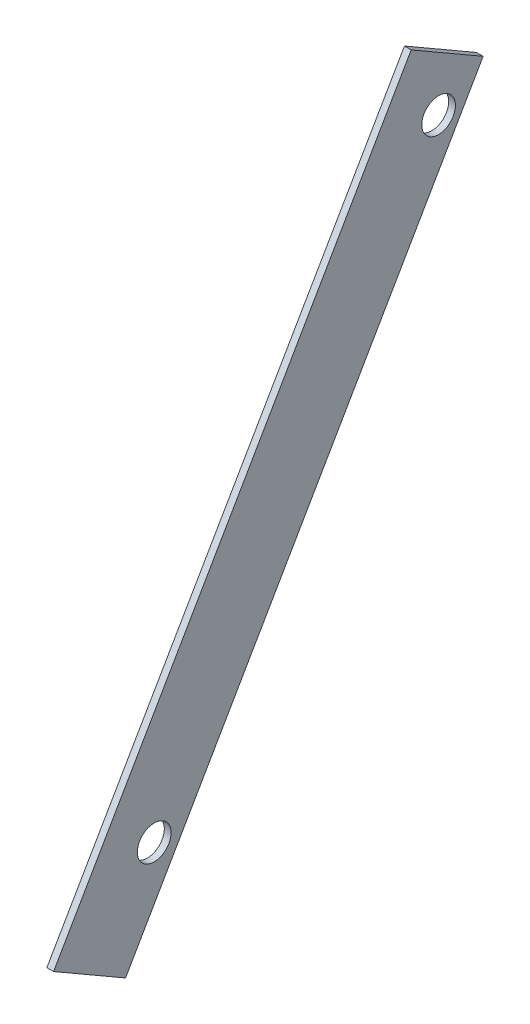
ISO-10303-21;
HEADER;
FILE_DESCRIPTION(('STEP AP214'),'2;1');
FILE_NAME('part.step','',(''),(''),'','','');
FILE_SCHEMA(('AUTOMOTIVE_DESIGN { 1 0 10303 214 1 1 1 1 }'));
ENDSEC;
DATA;
#1=APPLICATION_CONTEXT('core data for automotive mechanical design processes');
#2=APPLICATION_PROTOCOL_DEFINITION('international standard','automotive_design',2000,#1);
#3=PRODUCT_CONTEXT('',#1,'mechanical');
#4=PRODUCT('Part','Part','',(#3));
#5=PRODUCT_RELATED_PRODUCT_CATEGORY('part','',(#4));
#6=PRODUCT_DEFINITION_FORMATION('','',#4);
#7=PRODUCT_DEFINITION_CONTEXT('part definition',#1,'design');
#8=PRODUCT_DEFINITION('design','',#6,#7);
#9=PRODUCT_DEFINITION_SHAPE('','',#8);
#10=(LENGTH_UNIT() NAMED_UNIT(*) SI_UNIT(.MILLI.,.METRE.));
#11=(NAMED_UNIT(*) PLANE_ANGLE_UNIT() SI_UNIT($,.RADIAN.));
#12=(NAMED_UNIT(*) SI_UNIT($,.STERADIAN.) SOLID_ANGLE_UNIT());
#13=UNCERTAINTY_MEASURE_WITH_UNIT(LENGTH_MEASURE(1.E-05),#10,'distance_accuracy_value','');
#14=(GEOMETRIC_REPRESENTATION_CONTEXT(3) GLOBAL_UNCERTAINTY_ASSIGNED_CONTEXT((#13)) GLOBAL_UNIT_ASSIGNED_CONTEXT((#10,
#11,#12)) REPRESENTATION_CONTEXT('',''));
#15=CARTESIAN_POINT('',(0.,0.,0.));
#16=DIRECTION('',(0.,0.,1.));
#17=DIRECTION('',(1.,0.,0.));
#18=AXIS2_PLACEMENT_3D('',#15,#16,#17);
#19=CARTESIAN_POINT('',(20.,0.,0.));
#20=DIRECTION('',(0.,-0.866025403784439,0.5));
#21=DIRECTION('',(0.,-0.5,-0.866025403784439));
#22=AXIS2_PLACEMENT_3D('',#19,#20,#21);
#23=PLANE('',#22);
#24=DIRECTION('',(0.,0.5,0.866025403784438));
#25=VECTOR('',#24,1.);
#26=CARTESIAN_POINT('',(0.,0.,0.));
#27=LINE('',#26,#25);
#28=CARTESIAN_POINT('',(0.,0.,0.));
#29=VERTEX_POINT('',#28);
#30=CARTESIAN_POINT('',(0.,123.4,213.735069653999));
#31=VERTEX_POINT('',#30);
#32=EDGE_CURVE('E96',#29,#31,#27,.T.);
#33=ORIENTED_EDGE('',*,*,#32,.T.);
#34=DIRECTION('',(-1.,0.,0.));
#35=VECTOR('',#34,1.);
#36=CARTESIAN_POINT('',(20.,123.4,213.735069653999));
#37=LINE('',#36,#35);
#38=CARTESIAN_POINT('',(20.,123.4,213.735069653999));
#39=VERTEX_POINT('',#38);
#40=EDGE_CURVE('E11',#39,#31,#37,.T.);
#41=ORIENTED_EDGE('',*,*,#40,.F.);
#42=DIRECTION('',(0.,0.5,0.866025403784438));
#43=VECTOR('',#42,1.);
#44=CARTESIAN_POINT('',(20.,0.,0.));
#45=LINE('',#44,#43);
#46=CARTESIAN_POINT('',(20.,0.,0.));
#47=VERTEX_POINT('',#46);
#48=EDGE_CURVE('E84',#47,#39,#45,.T.);
#49=ORIENTED_EDGE('',*,*,#48,.F.);
#50=DIRECTION('',(-1.,0.,0.));
#51=VECTOR('',#50,1.);
#52=CARTESIAN_POINT('',(20.,0.,0.));
#53=LINE('',#52,#51);
#54=EDGE_CURVE('E92',#47,#29,#53,.T.);
#55=ORIENTED_EDGE('',*,*,#54,.T.);
#56=EDGE_LOOP('',(#33,#41,#49,#55));
#57=FACE_BOUND('',#56,.T.);
#58=ADVANCED_FACE('F33',(#57),#23,.F.);
#59=CARTESIAN_POINT('',(20.,123.4,213.735069653999));
#60=DIRECTION('',(0.,-0.5,-0.866025403784439));
#61=DIRECTION('',(0.,0.866025403784439,-0.5));
#62=AXIS2_PLACEMENT_3D('',#59,#60,#61);
#63=PLANE('',#62);
#64=DIRECTION('',(0.,-0.866025403784439,0.5));
#65=VECTOR('',#64,1.);
#66=CARTESIAN_POINT('',(0.,123.4,213.735069653999));
#67=LINE('',#66,#65);
#68=CARTESIAN_POINT('',(0.,-1715.95135509777,1275.685069654));
#69=VERTEX_POINT('',#68);
#70=EDGE_CURVE('E88',#31,#69,#67,.T.);
#71=ORIENTED_EDGE('',*,*,#70,.T.);
#72=DIRECTION('',(-1.,0.,0.));
#73=VECTOR('',#72,1.);
#74=CARTESIAN_POINT('',(20.,-1715.95135509777,1275.685069654));
#75=LINE('',#74,#73);
#76=CARTESIAN_POINT('',(20.,-1715.95135509777,1275.685069654));
#77=VERTEX_POINT('',#76);
#78=EDGE_CURVE('E41',#77,#69,#75,.T.);
#79=ORIENTED_EDGE('',*,*,#78,.F.);
#80=DIRECTION('',(0.,-0.866025403784439,0.5));
#81=VECTOR('',#80,1.);
#82=CARTESIAN_POINT('',(20.,123.4,213.735069653999));
#83=LINE('',#82,#81);
#84=EDGE_CURVE('E79',#39,#77,#83,.T.);
#85=ORIENTED_EDGE('',*,*,#84,.F.);
#86=ORIENTED_EDGE('',*,*,#40,.T.);
#87=EDGE_LOOP('',(#71,#79,#85,#86));
#88=FACE_BOUND('',#87,.T.);
#89=ADVANCED_FACE('F87',(#88),#63,.F.);
#90=CARTESIAN_POINT('',(20.,-1839.35135509776,1061.95000000001));
#91=DIRECTION('',(0.,0.866025403784439,-0.499999999999999));
#92=DIRECTION('',(0.,0.499999999999999,0.866025403784439));
#93=AXIS2_PLACEMENT_3D('',#90,#91,#92);
#94=PLANE('',#93);
#95=DIRECTION('',(0.,-0.499999999999999,-0.866025403784439));
#96=VECTOR('',#95,1.);
#97=CARTESIAN_POINT('',(0.,-1839.35135509776,1061.95000000001));
#98=LINE('',#97,#96);
#99=CARTESIAN_POINT('',(0.,-1839.35135509776,1061.95000000001));
#100=VERTEX_POINT('',#99);
#101=EDGE_CURVE('E66',#69,#100,#98,.T.);
#102=ORIENTED_EDGE('',*,*,#101,.T.);
#103=DIRECTION('',(-1.,0.,0.));
#104=VECTOR('',#103,1.);
#105=CARTESIAN_POINT('',(20.,-1839.35135509776,1061.95000000001));
#106=LINE('',#105,#104);
#107=CARTESIAN_POINT('',(20.,-1839.35135509776,1061.95000000001));
#108=VERTEX_POINT('',#107);
#109=EDGE_CURVE('E89',#108,#100,#106,.T.);
#110=ORIENTED_EDGE('',*,*,#109,.F.);
#111=DIRECTION('',(0.,-0.499999999999999,-0.866025403784439));
#112=VECTOR('',#111,1.);
#113=CARTESIAN_POINT('',(20.,-1839.35135509776,1061.95000000001));
#114=LINE('',#113,#112);
#115=EDGE_CURVE('E82',#77,#108,#114,.T.);
#116=ORIENTED_EDGE('',*,*,#115,.F.);
#117=ORIENTED_EDGE('',*,*,#78,.T.);
#118=EDGE_LOOP('',(#102,#110,#116,#117));
#119=FACE_BOUND('',#118,.T.);
#120=ADVANCED_FACE('F90',(#119),#94,.F.);
#121=CARTESIAN_POINT('',(20.,0.,0.));
#122=DIRECTION('',(0.,0.500000000000004,0.866025403784436));
#123=DIRECTION('',(0.,-0.866025403784436,0.500000000000004));
#124=AXIS2_PLACEMENT_3D('',#121,#122,#123);
#125=PLANE('',#124);
#126=DIRECTION('',(0.,0.866025403784436,-0.500000000000004));
#127=VECTOR('',#126,1.);
#128=CARTESIAN_POINT('',(0.,0.,0.));
#129=LINE('',#128,#127);
#130=EDGE_CURVE('E72',#100,#29,#129,.T.);
#131=ORIENTED_EDGE('',*,*,#130,.T.);
#132=ORIENTED_EDGE('',*,*,#54,.F.);
#133=DIRECTION('',(0.,0.866025403784436,-0.500000000000004));
#134=VECTOR('',#133,1.);
#135=CARTESIAN_POINT('',(20.,0.,0.));
#136=LINE('',#135,#134);
#137=EDGE_CURVE('E49',#108,#47,#136,.T.);
#138=ORIENTED_EDGE('',*,*,#137,.F.);
#139=ORIENTED_EDGE('',*,*,#109,.T.);
#140=EDGE_LOOP('',(#131,#132,#138,#139));
#141=FACE_BOUND('',#140,.T.);
#142=ADVANCED_FACE('F104',(#141),#125,.F.);
#143=CARTESIAN_POINT('',(20.,0.,0.));
#144=DIRECTION('',(1.,0.,0.));
#145=DIRECTION('',(0.,0.,-1.));
#146=AXIS2_PLACEMENT_3D('',#143,#144,#145);
#147=PLANE('',#146);
#148=CARTESIAN_POINT('',(20.,-85.0965291422329,132.380349241266));
#149=DIRECTION('',(1.,0.,0.));
#150=DIRECTION('',(0.,0.,-1.));
#151=AXIS2_PLACEMENT_3D('',#148,#149,#150);
#152=CIRCLE('',#151,50.);
#153=CARTESIAN_POINT('',(20.,-85.0965291422329,82.3803492412661));
#154=VERTEX_POINT('',#153);
#155=EDGE_CURVE('E116',#154,#154,#152,.T.);
#156=ORIENTED_EDGE('',*,*,#155,.F.);
#157=EDGE_LOOP('',(#156));
#158=FACE_BOUND('',#157,.T.);
#159=CARTESIAN_POINT('',(20.,-1533.27869894591,976.888502517654));
#160=DIRECTION('',(-1.,0.,0.));
#161=DIRECTION('',(0.,0.,1.));
#162=AXIS2_PLACEMENT_3D('',#159,#160,#161);
#163=CIRCLE('',#162,50.0000000000001);
#164=CARTESIAN_POINT('',(20.,-1533.27869894591,1026.88850251765));
#165=VERTEX_POINT('',#164);
#166=EDGE_CURVE('E99',#165,#165,#163,.T.);
#167=ORIENTED_EDGE('',*,*,#166,.T.);
#168=EDGE_LOOP('',(#167));
#169=FACE_BOUND('',#168,.T.);
#170=ORIENTED_EDGE('',*,*,#48,.T.);
#171=ORIENTED_EDGE('',*,*,#84,.T.);
#172=ORIENTED_EDGE('',*,*,#115,.T.);
#173=ORIENTED_EDGE('',*,*,#137,.T.);
#174=EDGE_LOOP('',(#170,#171,#172,#173));
#175=FACE_BOUND('',#174,.T.);
#176=ADVANCED_FACE('F80',(#158,#169,#175),#147,.T.);
#177=CARTESIAN_POINT('',(0.,0.,0.));
#178=DIRECTION('',(1.,0.,0.));
#179=DIRECTION('',(0.,0.,-1.));
#180=AXIS2_PLACEMENT_3D('',#177,#178,#179);
#181=PLANE('',#180);
#182=CARTESIAN_POINT('',(0.,-85.0965291422329,132.380349241266));
#183=DIRECTION('',(1.,0.,0.));
#184=DIRECTION('',(0.,0.,-1.));
#185=AXIS2_PLACEMENT_3D('',#182,#183,#184);
#186=CIRCLE('',#185,50.);
#187=CARTESIAN_POINT('',(0.,-85.0965291422329,82.3803492412661));
#188=VERTEX_POINT('',#187);
#189=EDGE_CURVE('E113',#188,#188,#186,.T.);
#190=ORIENTED_EDGE('',*,*,#189,.T.);
#191=EDGE_LOOP('',(#190));
#192=FACE_BOUND('',#191,.T.);
#193=CARTESIAN_POINT('',(0.,-1533.27869894591,976.888502517654));
#194=DIRECTION('',(-1.,0.,0.));
#195=DIRECTION('',(0.,0.,1.));
#196=AXIS2_PLACEMENT_3D('',#193,#194,#195);
#197=CIRCLE('',#196,50.0000000000001);
#198=CARTESIAN_POINT('',(0.,-1533.27869894591,1026.88850251765));
#199=VERTEX_POINT('',#198);
#200=EDGE_CURVE('E110',#199,#199,#197,.T.);
#201=ORIENTED_EDGE('',*,*,#200,.F.);
#202=EDGE_LOOP('',(#201));
#203=FACE_BOUND('',#202,.T.);
#204=ORIENTED_EDGE('',*,*,#32,.F.);
#205=ORIENTED_EDGE('',*,*,#130,.F.);
#206=ORIENTED_EDGE('',*,*,#101,.F.);
#207=ORIENTED_EDGE('',*,*,#70,.F.);
#208=EDGE_LOOP('',(#204,#205,#206,#207));
#209=FACE_BOUND('',#208,.T.);
#210=ADVANCED_FACE('F107',(#192,#203,#209),#181,.F.);
#211=CARTESIAN_POINT('',(20.,-1533.27869894591,976.888502517654));
#212=DIRECTION('',(-1.,0.,0.));
#213=DIRECTION('',(0.,0.,1.));
#214=AXIS2_PLACEMENT_3D('',#211,#212,#213);
#215=CYLINDRICAL_SURFACE('',#214,50.0000000000001);
#216=ORIENTED_EDGE('',*,*,#166,.F.);
#217=EDGE_LOOP('',(#216));
#218=FACE_BOUND('',#217,.T.);
#219=ORIENTED_EDGE('',*,*,#200,.T.);
#220=EDGE_LOOP('',(#219));
#221=FACE_BOUND('',#220,.T.);
#222=ADVANCED_FACE('F127',(#218,#221),#215,.F.);
#223=CARTESIAN_POINT('',(0.,-85.0965291422329,132.380349241266));
#224=DIRECTION('',(1.,0.,0.));
#225=DIRECTION('',(0.,0.,-1.));
#226=AXIS2_PLACEMENT_3D('',#223,#224,#225);
#227=CYLINDRICAL_SURFACE('',#226,50.);
#228=ORIENTED_EDGE('',*,*,#189,.F.);
#229=EDGE_LOOP('',(#228));
#230=FACE_BOUND('',#229,.T.);
#231=ORIENTED_EDGE('',*,*,#155,.T.);
#232=EDGE_LOOP('',(#231));
#233=FACE_BOUND('',#232,.T.);
#234=ADVANCED_FACE('F124',(#230,#233),#227,.F.);
#235=CLOSED_SHELL('',(#58,#89,#120,#142,#176,#210,#222,#234));
#236=MANIFOLD_SOLID_BREP('B2',#235);
#237=ADVANCED_BREP_SHAPE_REPRESENTATION('',(#18,#236),#14);
#238=SHAPE_DEFINITION_REPRESENTATION(#9,#237);
ENDSEC;
END-ISO-10303-21;
